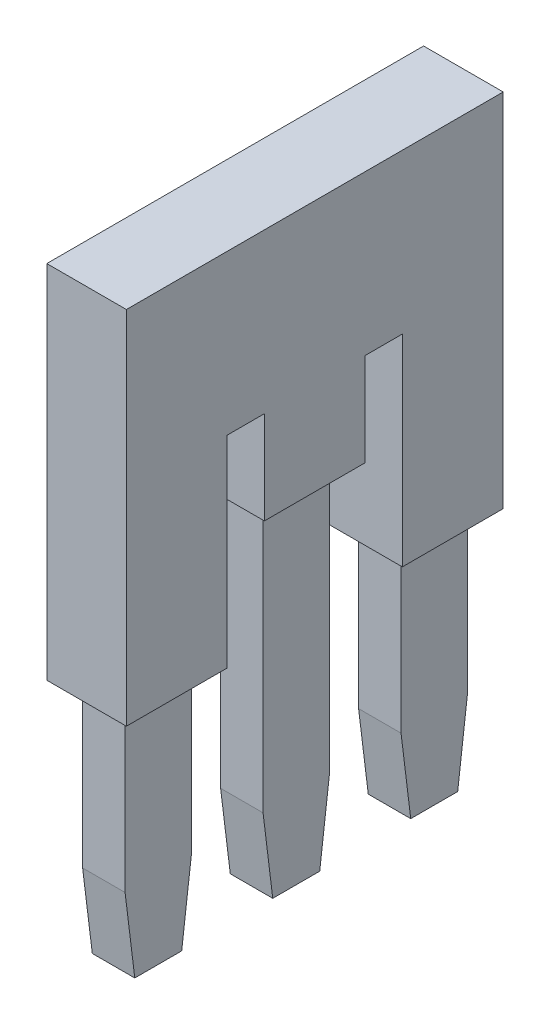
ISO-10303-21;
HEADER;
FILE_DESCRIPTION(('STEP AP214'),'2;1');
FILE_NAME('part.step','',(''),(''),'','','');
FILE_SCHEMA(('AUTOMOTIVE_DESIGN { 1 0 10303 214 1 1 1 1 }'));
ENDSEC;
DATA;
#1=APPLICATION_CONTEXT('core data for automotive mechanical design processes');
#2=APPLICATION_PROTOCOL_DEFINITION('international standard','automotive_design',2000,#1);
#3=PRODUCT_CONTEXT('',#1,'mechanical');
#4=PRODUCT('Part','Part','',(#3));
#5=PRODUCT_RELATED_PRODUCT_CATEGORY('part','',(#4));
#6=PRODUCT_DEFINITION_FORMATION('','',#4);
#7=PRODUCT_DEFINITION_CONTEXT('part definition',#1,'design');
#8=PRODUCT_DEFINITION('design','',#6,#7);
#9=PRODUCT_DEFINITION_SHAPE('','',#8);
#10=(LENGTH_UNIT() NAMED_UNIT(*) SI_UNIT(.MILLI.,.METRE.));
#11=(NAMED_UNIT(*) PLANE_ANGLE_UNIT() SI_UNIT($,.RADIAN.));
#12=(NAMED_UNIT(*) SI_UNIT($,.STERADIAN.) SOLID_ANGLE_UNIT());
#13=UNCERTAINTY_MEASURE_WITH_UNIT(LENGTH_MEASURE(1.E-05),#10,'distance_accuracy_value','');
#14=(GEOMETRIC_REPRESENTATION_CONTEXT(3) GLOBAL_UNCERTAINTY_ASSIGNED_CONTEXT((#13)) GLOBAL_UNIT_ASSIGNED_CONTEXT((#10,
#11,#12)) REPRESENTATION_CONTEXT('',''));
#15=CARTESIAN_POINT('',(0.,0.,0.));
#16=DIRECTION('',(0.,0.,1.));
#17=DIRECTION('',(1.,0.,0.));
#18=AXIS2_PLACEMENT_3D('',#15,#16,#17);
#19=CARTESIAN_POINT('',(3.17716482169511,-32.7169636307876,55.2099999999973));
#20=DIRECTION('',(0.,0.,1.));
#21=DIRECTION('',(1.,0.,0.));
#22=AXIS2_PLACEMENT_3D('',#19,#20,#21);
#23=PLANE('',#22);
#24=DIRECTION('',(1.,0.,0.));
#25=VECTOR('',#24,1.);
#26=CARTESIAN_POINT('',(4.10716722169511,-28.8757738570799,55.2099999999978));
#27=LINE('',#26,#25);
#28=CARTESIAN_POINT('',(3.30716722169511,-28.87577385708,55.2099999999974));
#29=VERTEX_POINT('',#28);
#30=CARTESIAN_POINT('',(4.90716722169511,-28.8757738570791,55.2099999999974));
#31=VERTEX_POINT('',#30);
#32=EDGE_CURVE('E232',#29,#31,#27,.T.);
#33=ORIENTED_EDGE('',*,*,#32,.F.);
#34=DIRECTION('',(0.,1.,0.));
#35=VECTOR('',#34,1.);
#36=CARTESIAN_POINT('',(3.30716722169511,-28.3020042035837,55.2099999999973));
#37=LINE('',#36,#35);
#38=CARTESIAN_POINT('',(3.30716722169511,-22.7750000000004,55.2099999999973));
#39=VERTEX_POINT('',#38);
#40=EDGE_CURVE('E217',#29,#39,#37,.T.);
#41=ORIENTED_EDGE('',*,*,#40,.T.);
#42=DIRECTION('',(1.,0.,0.));
#43=VECTOR('',#42,1.);
#44=CARTESIAN_POINT('',(3.17716482169511,-22.7750000000004,55.2099999999973));
#45=LINE('',#44,#43);
#46=CARTESIAN_POINT('',(4.90716722169511,-22.7750000000004,55.2099999999973));
#47=VERTEX_POINT('',#46);
#48=EDGE_CURVE('E19',#47,#39,#45,.F.);
#49=ORIENTED_EDGE('',*,*,#48,.F.);
#50=DIRECTION('',(0.,1.,0.));
#51=VECTOR('',#50,1.);
#52=CARTESIAN_POINT('',(4.90716722169511,-28.3020042035837,55.2099999999973));
#53=LINE('',#52,#51);
#54=EDGE_CURVE('E234',#31,#47,#53,.T.);
#55=ORIENTED_EDGE('',*,*,#54,.F.);
#56=EDGE_LOOP('',(#33,#41,#49,#55));
#57=FACE_BOUND('',#56,.T.);
#58=ADVANCED_FACE('F16',(#57),#23,.F.);
#59=CARTESIAN_POINT('',(4.10716722169511,-28.8757738570788,57.7100000000011));
#60=DIRECTION('',(0.,0.,1.));
#61=DIRECTION('',(0.,-1.,0.));
#62=AXIS2_PLACEMENT_3D('',#59,#60,#61);
#63=PLANE('',#62);
#64=DIRECTION('',(0.,1.,0.));
#65=VECTOR('',#64,1.);
#66=CARTESIAN_POINT('',(3.30716722169511,-28.3020042035837,57.7100000000012));
#67=LINE('',#66,#65);
#68=CARTESIAN_POINT('',(3.30716722169511,-22.7750000000004,57.7100000000012));
#69=VERTEX_POINT('',#68);
#70=CARTESIAN_POINT('',(3.30716722169511,-28.8757738570791,57.7100000000011));
#71=VERTEX_POINT('',#70);
#72=EDGE_CURVE('E228',#69,#71,#67,.F.);
#73=ORIENTED_EDGE('',*,*,#72,.T.);
#74=DIRECTION('',(1.,0.,0.));
#75=VECTOR('',#74,1.);
#76=CARTESIAN_POINT('',(4.10716722169511,-28.8757738570798,57.7100000000011));
#77=LINE('',#76,#75);
#78=CARTESIAN_POINT('',(4.90716722169511,-28.8757738570791,57.7100000000011));
#79=VERTEX_POINT('',#78);
#80=EDGE_CURVE('E210',#79,#71,#77,.F.);
#81=ORIENTED_EDGE('',*,*,#80,.F.);
#82=DIRECTION('',(0.,1.,0.));
#83=VECTOR('',#82,1.);
#84=CARTESIAN_POINT('',(4.90716722169511,-28.3020042035837,57.7100000000012));
#85=LINE('',#84,#83);
#86=CARTESIAN_POINT('',(4.90716722169511,-22.7750000000004,57.7100000000012));
#87=VERTEX_POINT('',#86);
#88=EDGE_CURVE('E245',#87,#79,#85,.F.);
#89=ORIENTED_EDGE('',*,*,#88,.F.);
#90=DIRECTION('',(1.,0.,0.));
#91=VECTOR('',#90,1.);
#92=CARTESIAN_POINT('',(4.10716722169511,-22.7750000000004,57.7100000000012));
#93=LINE('',#92,#91);
#94=EDGE_CURVE('E279',#87,#69,#93,.F.);
#95=ORIENTED_EDGE('',*,*,#94,.T.);
#96=EDGE_LOOP('',(#73,#81,#89,#95));
#97=FACE_BOUND('',#96,.T.);
#98=ADVANCED_FACE('F303',(#97),#63,.T.);
#99=CARTESIAN_POINT('',(4.10716722169511,-31.410934671701,57.3987213925599));
#100=DIRECTION('',(0.,-0.121869343405031,0.992546151641336));
#101=DIRECTION('',(0.,-0.992546151641336,-0.121869343405031));
#102=AXIS2_PLACEMENT_3D('',#99,#100,#101);
#103=PLANE('',#102);
#104=DIRECTION('',(0.,-0.992546151641336,-0.121869343405031));
#105=VECTOR('',#104,1.);
#106=CARTESIAN_POINT('',(3.30716722169511,-28.8757738570788,57.7100000000012));
#107=LINE('',#106,#105);
#108=CARTESIAN_POINT('',(3.30716722169511,-31.8499999999905,57.3448109490182));
#109=VERTEX_POINT('',#108);
#110=EDGE_CURVE('E247',#71,#109,#107,.T.);
#111=ORIENTED_EDGE('',*,*,#110,.T.);
#112=DIRECTION('',(1.,0.,0.));
#113=VECTOR('',#112,1.);
#114=CARTESIAN_POINT('',(4.10716722169511,-31.8499999999905,57.3448109490182));
#115=LINE('',#114,#113);
#116=CARTESIAN_POINT('',(4.90716722169511,-31.8499999999905,57.3448109490182));
#117=VERTEX_POINT('',#116);
#118=EDGE_CURVE('E239',#117,#109,#115,.F.);
#119=ORIENTED_EDGE('',*,*,#118,.F.);
#120=DIRECTION('',(0.,-0.992546151641336,-0.121869343405037));
#121=VECTOR('',#120,1.);
#122=CARTESIAN_POINT('',(4.90716722169511,-28.8757738570798,57.7100000000011));
#123=LINE('',#122,#121);
#124=EDGE_CURVE('E298',#79,#117,#123,.T.);
#125=ORIENTED_EDGE('',*,*,#124,.F.);
#126=ORIENTED_EDGE('',*,*,#80,.T.);
#127=EDGE_LOOP('',(#111,#119,#125,#126));
#128=FACE_BOUND('',#127,.T.);
#129=ADVANCED_FACE('F304',(#128),#103,.T.);
#130=CARTESIAN_POINT('',(4.10716722169511,-31.8500000000028,56.6599999999952));
#131=DIRECTION('',(0.,-1.,1.79170101017188E-11));
#132=DIRECTION('',(0.,-1.79170101017188E-11,-1.));
#133=AXIS2_PLACEMENT_3D('',#130,#131,#132);
#134=PLANE('',#133);
#135=DIRECTION('',(0.,0.,-1.));
#136=VECTOR('',#135,1.);
#137=CARTESIAN_POINT('',(3.30716722169511,-31.8499999999905,55.4470426133459));
#138=LINE('',#137,#136);
#139=CARTESIAN_POINT('',(3.30716722169511,-31.8500000000143,55.5751890509835));
#140=VERTEX_POINT('',#139);
#141=EDGE_CURVE('E243',#109,#140,#138,.T.);
#142=ORIENTED_EDGE('',*,*,#141,.T.);
#143=DIRECTION('',(1.,0.,0.));
#144=VECTOR('',#143,1.);
#145=CARTESIAN_POINT('',(4.10716722169511,-31.8500000000222,55.5751890509845));
#146=LINE('',#145,#144);
#147=CARTESIAN_POINT('',(4.90716722169511,-31.8500000000143,55.5751890509835));
#148=VERTEX_POINT('',#147);
#149=EDGE_CURVE('E238',#148,#140,#146,.F.);
#150=ORIENTED_EDGE('',*,*,#149,.F.);
#151=DIRECTION('',(0.,0.,-1.));
#152=VECTOR('',#151,1.);
#153=CARTESIAN_POINT('',(4.90716722169511,-31.8499999999905,55.4470426133458));
#154=LINE('',#153,#152);
#155=EDGE_CURVE('E292',#117,#148,#154,.T.);
#156=ORIENTED_EDGE('',*,*,#155,.F.);
#157=ORIENTED_EDGE('',*,*,#118,.T.);
#158=EDGE_LOOP('',(#142,#150,#156,#157));
#159=FACE_BOUND('',#158,.T.);
#160=ADVANCED_FACE('F306',(#159),#134,.T.);
#161=CARTESIAN_POINT('',(4.10716722169511,-28.5499999999608,55.1699999999978));
#162=DIRECTION('',(0.,-0.121869343405031,-0.992546151641336));
#163=DIRECTION('',(0.,0.992546151641336,-0.121869343405031));
#164=AXIS2_PLACEMENT_3D('',#161,#162,#163);
#165=PLANE('',#164);
#166=ORIENTED_EDGE('',*,*,#149,.T.);
#167=DIRECTION('',(0.,0.992546151641318,-0.12186934340518));
#168=VECTOR('',#167,1.);
#169=CARTESIAN_POINT('',(3.30716722169511,-31.8500000000222,55.5751890509845));
#170=LINE('',#169,#168);
#171=EDGE_CURVE('E222',#140,#29,#170,.T.);
#172=ORIENTED_EDGE('',*,*,#171,.T.);
#173=ORIENTED_EDGE('',*,*,#32,.T.);
#174=DIRECTION('',(0.,0.992546151641336,-0.121869343405034));
#175=VECTOR('',#174,1.);
#176=CARTESIAN_POINT('',(4.90716722169511,-31.8500000000222,55.5751890509845));
#177=LINE('',#176,#175);
#178=EDGE_CURVE('E290',#148,#31,#177,.T.);
#179=ORIENTED_EDGE('',*,*,#178,.F.);
#180=EDGE_LOOP('',(#166,#172,#173,#179));
#181=FACE_BOUND('',#180,.T.);
#182=ADVANCED_FACE('F241',(#181),#165,.T.);
#183=CARTESIAN_POINT('',(3.30716722169511,-31.8500000000099,45.8600000000035));
#184=DIRECTION('',(0.,-1.,1.79170101017188E-11));
#185=DIRECTION('',(0.,-1.79170101017188E-11,-1.));
#186=AXIS2_PLACEMENT_3D('',#183,#184,#185);
#187=PLANE('',#186);
#188=DIRECTION('',(0.,0.,-1.));
#189=VECTOR('',#188,1.);
#190=CARTESIAN_POINT('',(3.30716722169511,-31.8499999999905,34.6470426133458));
#191=LINE('',#190,#189);
#192=CARTESIAN_POINT('',(3.30716722169511,-31.8499999999905,46.9448109490182));
#193=VERTEX_POINT('',#192);
#194=CARTESIAN_POINT('',(3.30716722169511,-31.8500000000143,45.1751890509835));
#195=VERTEX_POINT('',#194);
#196=EDGE_CURVE('E437',#193,#195,#191,.T.);
#197=ORIENTED_EDGE('',*,*,#196,.T.);
#198=DIRECTION('',(1.,0.,0.));
#199=VECTOR('',#198,1.);
#200=CARTESIAN_POINT('',(4.10716722169511,-31.8500000000222,45.1751890509845));
#201=LINE('',#200,#199);
#202=CARTESIAN_POINT('',(4.90716722169511,-31.8500000000143,45.1751890509835));
#203=VERTEX_POINT('',#202);
#204=EDGE_CURVE('E275',#203,#195,#201,.F.);
#205=ORIENTED_EDGE('',*,*,#204,.F.);
#206=DIRECTION('',(0.,0.,-1.));
#207=VECTOR('',#206,1.);
#208=CARTESIAN_POINT('',(4.90716722169511,-31.8499999999905,34.6470426133458));
#209=LINE('',#208,#207);
#210=CARTESIAN_POINT('',(4.90716722169511,-31.8499999999905,46.9448109490182));
#211=VERTEX_POINT('',#210);
#212=EDGE_CURVE('E447',#211,#203,#209,.T.);
#213=ORIENTED_EDGE('',*,*,#212,.F.);
#214=DIRECTION('',(1.,0.,0.));
#215=VECTOR('',#214,1.);
#216=CARTESIAN_POINT('',(3.30716722169511,-31.8499999999905,46.9448109490181));
#217=LINE('',#216,#215);
#218=EDGE_CURVE('E265',#193,#211,#217,.T.);
#219=ORIENTED_EDGE('',*,*,#218,.F.);
#220=EDGE_LOOP('',(#197,#205,#213,#219));
#221=FACE_BOUND('',#220,.T.);
#222=ADVANCED_FACE('F314',(#221),#187,.T.);
#223=CARTESIAN_POINT('',(4.10716722169511,-31.410934671701,45.1212786074389));
#224=DIRECTION('',(0.,-0.121869343405031,-0.992546151641336));
#225=DIRECTION('',(0.,0.992546151641336,-0.121869343405031));
#226=AXIS2_PLACEMENT_3D('',#223,#224,#225);
#227=PLANE('',#226);
#228=DIRECTION('',(0.,0.992546151641333,-0.121869343405054));
#229=VECTOR('',#228,1.);
#230=CARTESIAN_POINT('',(4.90716722169511,-31.8500000000222,45.1751890509845));
#231=LINE('',#230,#229);
#232=CARTESIAN_POINT('',(4.90716722169511,-28.87577385708,44.8099999999976));
#233=VERTEX_POINT('',#232);
#234=EDGE_CURVE('E539',#203,#233,#231,.T.);
#235=ORIENTED_EDGE('',*,*,#234,.F.);
#236=ORIENTED_EDGE('',*,*,#204,.T.);
#237=DIRECTION('',(0.,0.992546151641335,-0.121869343405046));
#238=VECTOR('',#237,1.);
#239=CARTESIAN_POINT('',(3.30716722169511,-31.8500000000222,45.1751890509845));
#240=LINE('',#239,#238);
#241=CARTESIAN_POINT('',(3.30716722169511,-28.87577385708,44.8099999999975));
#242=VERTEX_POINT('',#241);
#243=EDGE_CURVE('E443',#195,#242,#240,.T.);
#244=ORIENTED_EDGE('',*,*,#243,.T.);
#245=DIRECTION('',(-1.,0.,0.));
#246=VECTOR('',#245,1.);
#247=CARTESIAN_POINT('',(4.10716722169511,-28.8757738570801,44.8099999999973));
#248=LINE('',#247,#246);
#249=EDGE_CURVE('E273',#233,#242,#248,.T.);
#250=ORIENTED_EDGE('',*,*,#249,.F.);
#251=EDGE_LOOP('',(#235,#236,#244,#250));
#252=FACE_BOUND('',#251,.T.);
#253=ADVANCED_FACE('F425',(#252),#227,.T.);
#254=CARTESIAN_POINT('',(4.10716722169511,-28.87577385708,44.8099999999973));
#255=DIRECTION('',(0.,0.,-1.));
#256=DIRECTION('',(-1.,0.,0.));
#257=AXIS2_PLACEMENT_3D('',#254,#255,#256);
#258=PLANE('',#257);
#259=DIRECTION('',(-1.,0.,0.));
#260=VECTOR('',#259,1.);
#261=CARTESIAN_POINT('',(4.10716722169511,-22.7750000000004,44.8099999999973));
#262=LINE('',#261,#260);
#263=CARTESIAN_POINT('',(3.30716722169511,-22.7750000000004,44.8099999999977));
#264=VERTEX_POINT('',#263);
#265=CARTESIAN_POINT('',(4.90716722169511,-22.7750000000004,44.8099999999977));
#266=VERTEX_POINT('',#265);
#267=EDGE_CURVE('E271',#264,#266,#262,.F.);
#268=ORIENTED_EDGE('',*,*,#267,.T.);
#269=DIRECTION('',(0.,1.,0.));
#270=VECTOR('',#269,1.);
#271=CARTESIAN_POINT('',(4.90716722169511,-28.3020042035837,44.8099999999977));
#272=LINE('',#271,#270);
#273=EDGE_CURVE('E536',#233,#266,#272,.T.);
#274=ORIENTED_EDGE('',*,*,#273,.F.);
#275=ORIENTED_EDGE('',*,*,#249,.T.);
#276=DIRECTION('',(0.,1.,0.));
#277=VECTOR('',#276,1.);
#278=CARTESIAN_POINT('',(3.30716722169511,-28.3020042035837,44.8099999999977));
#279=LINE('',#278,#277);
#280=EDGE_CURVE('E293',#242,#264,#279,.T.);
#281=ORIENTED_EDGE('',*,*,#280,.T.);
#282=EDGE_LOOP('',(#268,#274,#275,#281));
#283=FACE_BOUND('',#282,.T.);
#284=ADVANCED_FACE('F421',(#283),#258,.T.);
#285=CARTESIAN_POINT('',(4.23716962169511,-32.7169636307876,47.3100000000012));
#286=DIRECTION('',(0.,0.,-1.));
#287=DIRECTION('',(-1.,0.,0.));
#288=AXIS2_PLACEMENT_3D('',#285,#286,#287);
#289=PLANE('',#288);
#290=DIRECTION('',(1.,0.,0.));
#291=VECTOR('',#290,1.);
#292=CARTESIAN_POINT('',(3.30716722169511,-28.8757738570788,47.3100000000011));
#293=LINE('',#292,#291);
#294=CARTESIAN_POINT('',(4.90716722169511,-28.8757738570792,47.3100000000011));
#295=VERTEX_POINT('',#294);
#296=CARTESIAN_POINT('',(3.30716722169511,-28.8757738570788,47.3100000000012));
#297=VERTEX_POINT('',#296);
#298=EDGE_CURVE('E267',#295,#297,#293,.F.);
#299=ORIENTED_EDGE('',*,*,#298,.F.);
#300=DIRECTION('',(0.,1.,0.));
#301=VECTOR('',#300,1.);
#302=CARTESIAN_POINT('',(4.90716722169511,-28.3020042035837,47.310000000001));
#303=LINE('',#302,#301);
#304=CARTESIAN_POINT('',(4.90716722169511,-22.7750000000004,47.3100000000012));
#305=VERTEX_POINT('',#304);
#306=EDGE_CURVE('E534',#305,#295,#303,.F.);
#307=ORIENTED_EDGE('',*,*,#306,.F.);
#308=DIRECTION('',(-1.,0.,0.));
#309=VECTOR('',#308,1.);
#310=CARTESIAN_POINT('',(4.23716962169511,-22.7750000000004,47.3100000000012));
#311=LINE('',#310,#309);
#312=CARTESIAN_POINT('',(3.30716722169511,-22.7750000000004,47.3100000000012));
#313=VERTEX_POINT('',#312);
#314=EDGE_CURVE('E269',#313,#305,#311,.F.);
#315=ORIENTED_EDGE('',*,*,#314,.F.);
#316=DIRECTION('',(0.,1.,0.));
#317=VECTOR('',#316,1.);
#318=CARTESIAN_POINT('',(3.30716722169511,-28.3020042035837,47.3100000000012));
#319=LINE('',#318,#317);
#320=EDGE_CURVE('E296',#313,#297,#319,.F.);
#321=ORIENTED_EDGE('',*,*,#320,.T.);
#322=EDGE_LOOP('',(#299,#307,#315,#321));
#323=FACE_BOUND('',#322,.T.);
#324=ADVANCED_FACE('F417',(#323),#289,.F.);
#325=CARTESIAN_POINT('',(3.30716722169511,-31.410934671701,46.9987213925598));
#326=DIRECTION('',(0.,-0.121869343405031,0.992546151641336));
#327=DIRECTION('',(0.,-0.992546151641336,-0.121869343405031));
#328=AXIS2_PLACEMENT_3D('',#325,#326,#327);
#329=PLANE('',#328);
#330=ORIENTED_EDGE('',*,*,#218,.T.);
#331=DIRECTION('',(0.,-0.992546151641336,-0.121869343405033));
#332=VECTOR('',#331,1.);
#333=CARTESIAN_POINT('',(4.90716722169511,-28.8757738570788,47.3100000000012));
#334=LINE('',#333,#332);
#335=EDGE_CURVE('E531',#295,#211,#334,.T.);
#336=ORIENTED_EDGE('',*,*,#335,.F.);
#337=ORIENTED_EDGE('',*,*,#298,.T.);
#338=DIRECTION('',(0.,-0.992546151641336,-0.121869343405033));
#339=VECTOR('',#338,1.);
#340=CARTESIAN_POINT('',(3.30716722169511,-28.8757738570788,47.3100000000012));
#341=LINE('',#340,#339);
#342=EDGE_CURVE('E444',#297,#193,#341,.T.);
#343=ORIENTED_EDGE('',*,*,#342,.T.);
#344=EDGE_LOOP('',(#330,#336,#337,#343));
#345=FACE_BOUND('',#344,.T.);
#346=ADVANCED_FACE('F413',(#345),#329,.T.);
#347=CARTESIAN_POINT('',(4.10716722169511,-31.410934671701,50.3212786074393));
#348=DIRECTION('',(0.,-0.121869343405041,-0.992546151641335));
#349=DIRECTION('',(0.,0.992546151641335,-0.121869343405041));
#350=AXIS2_PLACEMENT_3D('',#347,#348,#349);
#351=PLANE('',#350);
#352=DIRECTION('',(0.,-0.992546151641337,0.121869343405021));
#353=VECTOR('',#352,1.);
#354=CARTESIAN_POINT('',(4.90716722169511,-28.87577385708,50.0099999999981));
#355=LINE('',#354,#353);
#356=CARTESIAN_POINT('',(4.90716722169511,-28.87577385708,50.0099999999981));
#357=VERTEX_POINT('',#356);
#358=CARTESIAN_POINT('',(4.90716722169511,-31.8500000000294,50.3751890509857));
#359=VERTEX_POINT('',#358);
#360=EDGE_CURVE('E517',#357,#359,#355,.T.);
#361=ORIENTED_EDGE('',*,*,#360,.T.);
#362=DIRECTION('',(1.,0.,0.));
#363=VECTOR('',#362,1.);
#364=CARTESIAN_POINT('',(4.10716722169511,-31.8500000000293,50.3751890509857));
#365=LINE('',#364,#363);
#366=CARTESIAN_POINT('',(3.30716722168535,-31.8500000000294,50.3751890509857));
#367=VERTEX_POINT('',#366);
#368=EDGE_CURVE('E263',#367,#359,#365,.T.);
#369=ORIENTED_EDGE('',*,*,#368,.F.);
#370=DIRECTION('',(0.,-0.992546151641337,0.121869343405021));
#371=VECTOR('',#370,1.);
#372=CARTESIAN_POINT('',(3.30716722168535,-28.87577385708,50.0099999999981));
#373=LINE('',#372,#371);
#374=CARTESIAN_POINT('',(3.30716722168535,-28.87577385708,50.0099999999981));
#375=VERTEX_POINT('',#374);
#376=EDGE_CURVE('E512',#375,#367,#373,.T.);
#377=ORIENTED_EDGE('',*,*,#376,.F.);
#378=DIRECTION('',(-1.,0.,0.));
#379=VECTOR('',#378,1.);
#380=CARTESIAN_POINT('',(4.10716722169511,-28.87577385708,50.0099999999981));
#381=LINE('',#380,#379);
#382=EDGE_CURVE('E255',#357,#375,#381,.T.);
#383=ORIENTED_EDGE('',*,*,#382,.F.);
#384=EDGE_LOOP('',(#361,#369,#377,#383));
#385=FACE_BOUND('',#384,.T.);
#386=ADVANCED_FACE('F409',(#385),#351,.T.);
#387=CARTESIAN_POINT('',(4.10716722169511,-31.8500000000099,51.4599999999956));
#388=DIRECTION('',(0.,-1.,1.79170101017133E-11));
#389=DIRECTION('',(0.,-1.79170101017133E-11,-1.));
#390=AXIS2_PLACEMENT_3D('',#387,#388,#389);
#391=PLANE('',#390);
#392=DIRECTION('',(0.,0.,1.));
#393=VECTOR('',#392,1.);
#394=CARTESIAN_POINT('',(3.30716722168535,-31.8500000000294,51.379551985078));
#395=LINE('',#394,#393);
#396=CARTESIAN_POINT('',(3.30716722168535,-31.8500000000056,52.1448109490169));
#397=VERTEX_POINT('',#396);
#398=EDGE_CURVE('E510',#367,#397,#395,.T.);
#399=ORIENTED_EDGE('',*,*,#398,.F.);
#400=ORIENTED_EDGE('',*,*,#368,.T.);
#401=DIRECTION('',(0.,0.,1.));
#402=VECTOR('',#401,1.);
#403=CARTESIAN_POINT('',(4.90716722169511,-31.8500000000294,51.379551985078));
#404=LINE('',#403,#402);
#405=CARTESIAN_POINT('',(4.90716722169511,-31.8500000000056,52.144810949017));
#406=VERTEX_POINT('',#405);
#407=EDGE_CURVE('E514',#359,#406,#404,.T.);
#408=ORIENTED_EDGE('',*,*,#407,.T.);
#409=DIRECTION('',(1.,0.,0.));
#410=VECTOR('',#409,1.);
#411=CARTESIAN_POINT('',(4.10716722169511,-31.8499999999977,52.1448109490179));
#412=LINE('',#411,#410);
#413=EDGE_CURVE('E261',#397,#406,#412,.T.);
#414=ORIENTED_EDGE('',*,*,#413,.F.);
#415=EDGE_LOOP('',(#399,#400,#408,#414));
#416=FACE_BOUND('',#415,.T.);
#417=ADVANCED_FACE('F405',(#416),#391,.T.);
#418=CARTESIAN_POINT('',(4.10716722169511,-31.410934671701,52.1987213925605));
#419=DIRECTION('',(0.,-0.121869343405041,0.992546151641335));
#420=DIRECTION('',(0.,-0.992546151641335,-0.121869343405041));
#421=AXIS2_PLACEMENT_3D('',#418,#419,#420);
#422=PLANE('',#421);
#423=DIRECTION('',(1.,0.,0.));
#424=VECTOR('',#423,1.);
#425=CARTESIAN_POINT('',(4.10716722169511,-28.8757738570883,52.5100000000007));
#426=LINE('',#425,#424);
#427=CARTESIAN_POINT('',(3.30716722168535,-28.8757738570883,52.5100000000007));
#428=VERTEX_POINT('',#427);
#429=CARTESIAN_POINT('',(4.90716722169511,-28.8757738570883,52.5100000000007));
#430=VERTEX_POINT('',#429);
#431=EDGE_CURVE('E259',#428,#430,#426,.T.);
#432=ORIENTED_EDGE('',*,*,#431,.F.);
#433=DIRECTION('',(0.,0.992546151641333,0.121869343405058));
#434=VECTOR('',#433,1.);
#435=CARTESIAN_POINT('',(3.30716722168535,-31.8499999999977,52.1448109490179));
#436=LINE('',#435,#434);
#437=EDGE_CURVE('E508',#397,#428,#436,.T.);
#438=ORIENTED_EDGE('',*,*,#437,.F.);
#439=ORIENTED_EDGE('',*,*,#413,.T.);
#440=DIRECTION('',(0.,0.992546151641333,0.121869343405058));
#441=VECTOR('',#440,1.);
#442=CARTESIAN_POINT('',(4.90716722169511,-31.8499999999977,52.1448109490179));
#443=LINE('',#442,#441);
#444=EDGE_CURVE('E526',#406,#430,#443,.T.);
#445=ORIENTED_EDGE('',*,*,#444,.T.);
#446=EDGE_LOOP('',(#432,#438,#439,#445));
#447=FACE_BOUND('',#446,.T.);
#448=ADVANCED_FACE('F401',(#447),#422,.T.);
#449=CARTESIAN_POINT('',(4.10716722169511,-28.8757738570883,52.5100000000007));
#450=DIRECTION('',(0.,0.,1.));
#451=DIRECTION('',(1.,0.,0.));
#452=AXIS2_PLACEMENT_3D('',#449,#450,#451);
#453=PLANE('',#452);
#454=DIRECTION('',(1.,0.,0.));
#455=VECTOR('',#454,1.);
#456=CARTESIAN_POINT('',(4.10716722169511,-18.6750000000004,52.5100000000007));
#457=LINE('',#456,#455);
#458=CARTESIAN_POINT('',(4.90716722169511,-18.6750000000004,52.5100000000007));
#459=VERTEX_POINT('',#458);
#460=CARTESIAN_POINT('',(3.30716722168535,-18.6750000000004,52.5100000000007));
#461=VERTEX_POINT('',#460);
#462=EDGE_CURVE('E257',#459,#461,#457,.F.);
#463=ORIENTED_EDGE('',*,*,#462,.T.);
#464=DIRECTION('',(0.,1.,0.));
#465=VECTOR('',#464,1.);
#466=CARTESIAN_POINT('',(3.30716722168535,-27.6497789998261,52.5100000000007));
#467=LINE('',#466,#465);
#468=EDGE_CURVE('E505',#428,#461,#467,.T.);
#469=ORIENTED_EDGE('',*,*,#468,.F.);
#470=ORIENTED_EDGE('',*,*,#431,.T.);
#471=DIRECTION('',(0.,1.,0.));
#472=VECTOR('',#471,1.);
#473=CARTESIAN_POINT('',(4.90716722169511,-27.6247789998288,52.5100000000007));
#474=LINE('',#473,#472);
#475=EDGE_CURVE('E523',#430,#459,#474,.T.);
#476=ORIENTED_EDGE('',*,*,#475,.T.);
#477=EDGE_LOOP('',(#463,#469,#470,#476));
#478=FACE_BOUND('',#477,.T.);
#479=ADVANCED_FACE('F397',(#478),#453,.T.);
#480=CARTESIAN_POINT('',(4.10716722169511,-28.87577385708,50.0099999999981));
#481=DIRECTION('',(0.,0.,-1.));
#482=DIRECTION('',(-1.,0.,0.));
#483=AXIS2_PLACEMENT_3D('',#480,#481,#482);
#484=PLANE('',#483);
#485=DIRECTION('',(-1.,0.,0.));
#486=VECTOR('',#485,1.);
#487=CARTESIAN_POINT('',(4.10716722169511,-18.6750000000004,50.0099999999981));
#488=LINE('',#487,#486);
#489=CARTESIAN_POINT('',(3.30716722168535,-18.6750000000004,50.0099999999981));
#490=VERTEX_POINT('',#489);
#491=CARTESIAN_POINT('',(4.90716722169511,-18.6750000000004,50.0099999999981));
#492=VERTEX_POINT('',#491);
#493=EDGE_CURVE('E229',#490,#492,#488,.F.);
#494=ORIENTED_EDGE('',*,*,#493,.T.);
#495=DIRECTION('',(0.,1.,0.));
#496=VECTOR('',#495,1.);
#497=CARTESIAN_POINT('',(4.90716722169511,-27.6247789998288,50.0099999999981));
#498=LINE('',#497,#496);
#499=EDGE_CURVE('E520',#492,#357,#498,.F.);
#500=ORIENTED_EDGE('',*,*,#499,.T.);
#501=ORIENTED_EDGE('',*,*,#382,.T.);
#502=DIRECTION('',(0.,1.,0.));
#503=VECTOR('',#502,1.);
#504=CARTESIAN_POINT('',(3.30716722168535,-27.6497789998261,50.0099999999981));
#505=LINE('',#504,#503);
#506=EDGE_CURVE('E502',#490,#375,#505,.F.);
#507=ORIENTED_EDGE('',*,*,#506,.F.);
#508=EDGE_LOOP('',(#494,#500,#501,#507));
#509=FACE_BOUND('',#508,.T.);
#510=ADVANCED_FACE('F394',(#509),#484,.T.);
#511=CARTESIAN_POINT('',(3.30716722169511,-28.3020042035837,55.4470426133459));
#512=DIRECTION('',(1.,0.,0.));
#513=DIRECTION('',(0.,0.,-1.));
#514=AXIS2_PLACEMENT_3D('',#511,#512,#513);
#515=PLANE('',#514);
#516=ORIENTED_EDGE('',*,*,#141,.F.);
#517=ORIENTED_EDGE('',*,*,#110,.F.);
#518=ORIENTED_EDGE('',*,*,#72,.F.);
#519=DIRECTION('',(0.,0.,-1.));
#520=VECTOR('',#519,1.);
#521=CARTESIAN_POINT('',(3.30716722169511,-22.7750000000004,58.3599999999988));
#522=LINE('',#521,#520);
#523=EDGE_CURVE('E226',#39,#69,#522,.F.);
#524=ORIENTED_EDGE('',*,*,#523,.F.);
#525=ORIENTED_EDGE('',*,*,#40,.F.);
#526=ORIENTED_EDGE('',*,*,#171,.F.);
#527=EDGE_LOOP('',(#516,#517,#518,#524,#525,#526));
#528=FACE_BOUND('',#527,.T.);
#529=ADVANCED_FACE('F220',(#528),#515,.F.);
#530=CARTESIAN_POINT('',(4.90716722169511,-28.3020042035837,55.4470426133458));
#531=DIRECTION('',(1.,0.,0.));
#532=DIRECTION('',(0.,0.,-1.));
#533=AXIS2_PLACEMENT_3D('',#530,#531,#532);
#534=PLANE('',#533);
#535=ORIENTED_EDGE('',*,*,#155,.T.);
#536=ORIENTED_EDGE('',*,*,#178,.T.);
#537=ORIENTED_EDGE('',*,*,#54,.T.);
#538=DIRECTION('',(0.,0.,-1.));
#539=VECTOR('',#538,1.);
#540=CARTESIAN_POINT('',(4.90716722169511,-22.7750000000004,58.3599999999988));
#541=LINE('',#540,#539);
#542=EDGE_CURVE('E287',#87,#47,#541,.T.);
#543=ORIENTED_EDGE('',*,*,#542,.F.);
#544=ORIENTED_EDGE('',*,*,#88,.T.);
#545=ORIENTED_EDGE('',*,*,#124,.T.);
#546=EDGE_LOOP('',(#535,#536,#537,#543,#544,#545));
#547=FACE_BOUND('',#546,.T.);
#548=ADVANCED_FACE('F289',(#547),#534,.T.);
#549=CARTESIAN_POINT('',(3.30716722169511,-28.3020042035837,34.6470426133458));
#550=DIRECTION('',(1.,0.,0.));
#551=DIRECTION('',(0.,0.,-1.));
#552=AXIS2_PLACEMENT_3D('',#549,#550,#551);
#553=PLANE('',#552);
#554=ORIENTED_EDGE('',*,*,#196,.F.);
#555=ORIENTED_EDGE('',*,*,#342,.F.);
#556=ORIENTED_EDGE('',*,*,#320,.F.);
#557=DIRECTION('',(0.,0.,-1.));
#558=VECTOR('',#557,1.);
#559=CARTESIAN_POINT('',(3.30716722169511,-22.7750000000004,47.9599999999988));
#560=LINE('',#559,#558);
#561=EDGE_CURVE('E459',#264,#313,#560,.F.);
#562=ORIENTED_EDGE('',*,*,#561,.F.);
#563=ORIENTED_EDGE('',*,*,#280,.F.);
#564=ORIENTED_EDGE('',*,*,#243,.F.);
#565=EDGE_LOOP('',(#554,#555,#556,#562,#563,#564));
#566=FACE_BOUND('',#565,.T.);
#567=ADVANCED_FACE('F385',(#566),#553,.F.);
#568=CARTESIAN_POINT('',(4.90716722169511,-28.3020042035837,34.6470426133458));
#569=DIRECTION('',(1.,0.,0.));
#570=DIRECTION('',(0.,0.,-1.));
#571=AXIS2_PLACEMENT_3D('',#568,#569,#570);
#572=PLANE('',#571);
#573=ORIENTED_EDGE('',*,*,#306,.T.);
#574=ORIENTED_EDGE('',*,*,#335,.T.);
#575=ORIENTED_EDGE('',*,*,#212,.T.);
#576=ORIENTED_EDGE('',*,*,#234,.T.);
#577=ORIENTED_EDGE('',*,*,#273,.T.);
#578=DIRECTION('',(0.,0.,-1.));
#579=VECTOR('',#578,1.);
#580=CARTESIAN_POINT('',(4.90716722169511,-22.7750000000004,47.9599999999988));
#581=LINE('',#580,#579);
#582=EDGE_CURVE('E462',#305,#266,#581,.T.);
#583=ORIENTED_EDGE('',*,*,#582,.F.);
#584=EDGE_LOOP('',(#573,#574,#575,#576,#577,#583));
#585=FACE_BOUND('',#584,.T.);
#586=ADVANCED_FACE('F381',(#585),#572,.T.);
#587=CARTESIAN_POINT('',(5.00030634412967,-15.1750000000004,47.3339438048216));
#588=DIRECTION('',(0.,-1.,0.));
#589=DIRECTION('',(0.,0.,-1.));
#590=AXIS2_PLACEMENT_3D('',#587,#588,#589);
#591=PLANE('',#590);
#592=DIRECTION('',(1.,0.,0.));
#593=VECTOR('',#592,1.);
#594=CARTESIAN_POINT('',(5.60716722168537,-15.1750000000004,47.9599999999988));
#595=LINE('',#594,#593);
#596=CARTESIAN_POINT('',(5.60716722168537,-15.1750000000004,47.9599999999988));
#597=VERTEX_POINT('',#596);
#598=CARTESIAN_POINT('',(2.60716722168536,-15.1750000000004,47.9599999999988));
#599=VERTEX_POINT('',#598);
#600=EDGE_CURVE('E465',#597,#599,#595,.F.);
#601=ORIENTED_EDGE('',*,*,#600,.F.);
#602=DIRECTION('',(0.,0.,-1.));
#603=VECTOR('',#602,1.);
#604=CARTESIAN_POINT('',(5.60716722168537,-15.1750000000004,47.3339438048216));
#605=LINE('',#604,#603);
#606=CARTESIAN_POINT('',(5.60716722168537,-15.1750000000004,49.3599999999988));
#607=VERTEX_POINT('',#606);
#608=EDGE_CURVE('E529',#597,#607,#605,.F.);
#609=ORIENTED_EDGE('',*,*,#608,.T.);
#610=DIRECTION('',(-1.,0.,0.));
#611=VECTOR('',#610,1.);
#612=CARTESIAN_POINT('',(5.60716722168537,-15.1750000000004,49.3599999999988));
#613=LINE('',#612,#611);
#614=CARTESIAN_POINT('',(2.60716722168536,-15.1750000000004,49.3599999999988));
#615=VERTEX_POINT('',#614);
#616=EDGE_CURVE('E547',#615,#607,#613,.F.);
#617=ORIENTED_EDGE('',*,*,#616,.F.);
#618=DIRECTION('',(0.,0.,1.));
#619=VECTOR('',#618,1.);
#620=CARTESIAN_POINT('',(2.60716722168536,-15.1750000000004,52.8944836175016));
#621=LINE('',#620,#619);
#622=EDGE_CURVE('E498',#599,#615,#621,.T.);
#623=ORIENTED_EDGE('',*,*,#622,.F.);
#624=EDGE_LOOP('',(#601,#609,#617,#623));
#625=FACE_BOUND('',#624,.T.);
#626=ADVANCED_FACE('F377',(#625),#591,.T.);
#627=CARTESIAN_POINT('',(4.90716722169511,-27.6247789998288,51.379551985078));
#628=DIRECTION('',(-1.,0.,0.));
#629=DIRECTION('',(0.,0.,1.));
#630=AXIS2_PLACEMENT_3D('',#627,#628,#629);
#631=PLANE('',#630);
#632=ORIENTED_EDGE('',*,*,#360,.F.);
#633=ORIENTED_EDGE('',*,*,#499,.F.);
#634=DIRECTION('',(0.,0.,-1.));
#635=VECTOR('',#634,1.);
#636=CARTESIAN_POINT('',(4.90716722169511,-18.6750000000004,53.1599999999988));
#637=LINE('',#636,#635);
#638=EDGE_CURVE('E591',#459,#492,#637,.T.);
#639=ORIENTED_EDGE('',*,*,#638,.F.);
#640=ORIENTED_EDGE('',*,*,#475,.F.);
#641=ORIENTED_EDGE('',*,*,#444,.F.);
#642=ORIENTED_EDGE('',*,*,#407,.F.);
#643=EDGE_LOOP('',(#632,#633,#639,#640,#641,#642));
#644=FACE_BOUND('',#643,.T.);
#645=ADVANCED_FACE('F373',(#644),#631,.F.);
#646=CARTESIAN_POINT('',(3.30716722168535,-27.6497789998261,51.379551985078));
#647=DIRECTION('',(-1.,0.,0.));
#648=DIRECTION('',(0.,0.,1.));
#649=AXIS2_PLACEMENT_3D('',#646,#647,#648);
#650=PLANE('',#649);
#651=DIRECTION('',(0.,0.,-1.));
#652=VECTOR('',#651,1.);
#653=CARTESIAN_POINT('',(3.30716722168535,-18.6750000000004,53.1599999999988));
#654=LINE('',#653,#652);
#655=EDGE_CURVE('E588',#490,#461,#654,.F.);
#656=ORIENTED_EDGE('',*,*,#655,.F.);
#657=ORIENTED_EDGE('',*,*,#506,.T.);
#658=ORIENTED_EDGE('',*,*,#376,.T.);
#659=ORIENTED_EDGE('',*,*,#398,.T.);
#660=ORIENTED_EDGE('',*,*,#437,.T.);
#661=ORIENTED_EDGE('',*,*,#468,.T.);
#662=EDGE_LOOP('',(#656,#657,#658,#659,#660,#661));
#663=FACE_BOUND('',#662,.T.);
#664=ADVANCED_FACE('F369',(#663),#650,.T.);
#665=CARTESIAN_POINT('',(5.00030634412967,-15.1750000000004,47.3339438048216));
#666=DIRECTION('',(0.,-1.,0.));
#667=DIRECTION('',(0.,0.,-1.));
#668=AXIS2_PLACEMENT_3D('',#665,#666,#667);
#669=PLANE('',#668);
#670=DIRECTION('',(1.,0.,0.));
#671=VECTOR('',#670,1.);
#672=CARTESIAN_POINT('',(5.60716722168537,-15.1750000000004,53.1599999999988));
#673=LINE('',#672,#671);
#674=CARTESIAN_POINT('',(5.60716722168537,-15.1750000000004,53.1599999999988));
#675=VERTEX_POINT('',#674);
#676=CARTESIAN_POINT('',(2.60716722168536,-15.1750000000004,53.1599999999988));
#677=VERTEX_POINT('',#676);
#678=EDGE_CURVE('E586',#675,#677,#673,.F.);
#679=ORIENTED_EDGE('',*,*,#678,.F.);
#680=DIRECTION('',(0.,0.,-1.));
#681=VECTOR('',#680,1.);
#682=CARTESIAN_POINT('',(5.60716722168537,-15.1750000000004,47.3339438048216));
#683=LINE('',#682,#681);
#684=CARTESIAN_POINT('',(5.60716722168537,-15.1750000000004,54.5599999999988));
#685=VERTEX_POINT('',#684);
#686=EDGE_CURVE('E500',#675,#685,#683,.F.);
#687=ORIENTED_EDGE('',*,*,#686,.T.);
#688=DIRECTION('',(-1.,0.,0.));
#689=VECTOR('',#688,1.);
#690=CARTESIAN_POINT('',(5.60716722168537,-15.1750000000004,54.5599999999988));
#691=LINE('',#690,#689);
#692=CARTESIAN_POINT('',(2.60716722168536,-15.1750000000004,54.5599999999988));
#693=VERTEX_POINT('',#692);
#694=EDGE_CURVE('E490',#693,#685,#691,.F.);
#695=ORIENTED_EDGE('',*,*,#694,.F.);
#696=DIRECTION('',(0.,0.,1.));
#697=VECTOR('',#696,1.);
#698=CARTESIAN_POINT('',(2.60716722168536,-15.1750000000004,52.8944836175016));
#699=LINE('',#698,#697);
#700=EDGE_CURVE('E496',#677,#693,#699,.T.);
#701=ORIENTED_EDGE('',*,*,#700,.F.);
#702=EDGE_LOOP('',(#679,#687,#695,#701));
#703=FACE_BOUND('',#702,.T.);
#704=ADVANCED_FACE('F365',(#703),#669,.T.);
#705=CARTESIAN_POINT('',(2.60716722168536,-10.116373989214,52.8944836175016));
#706=DIRECTION('',(-1.,0.,0.));
#707=DIRECTION('',(0.,0.,1.));
#708=AXIS2_PLACEMENT_3D('',#705,#706,#707);
#709=PLANE('',#708);
#710=DIRECTION('',(0.,1.,0.));
#711=VECTOR('',#710,1.);
#712=CARTESIAN_POINT('',(2.60716722168536,-22.7750000000004,44.1599999999988));
#713=LINE('',#712,#711);
#714=CARTESIAN_POINT('',(2.60716722168536,-22.7750000000004,44.1599999999988));
#715=VERTEX_POINT('',#714);
#716=CARTESIAN_POINT('',(2.60716722168536,-9.1750000000004,44.1599999999988));
#717=VERTEX_POINT('',#716);
#718=EDGE_CURVE('E474',#715,#717,#713,.T.);
#719=ORIENTED_EDGE('',*,*,#718,.F.);
#720=DIRECTION('',(0.,0.,-1.));
#721=VECTOR('',#720,1.);
#722=CARTESIAN_POINT('',(2.60716722168536,-22.7750000000004,47.9599999999988));
#723=LINE('',#722,#721);
#724=CARTESIAN_POINT('',(2.60716722168536,-22.7750000000004,47.9599999999988));
#725=VERTEX_POINT('',#724);
#726=EDGE_CURVE('E467',#725,#715,#723,.T.);
#727=ORIENTED_EDGE('',*,*,#726,.F.);
#728=DIRECTION('',(0.,1.,0.));
#729=VECTOR('',#728,1.);
#730=CARTESIAN_POINT('',(2.60716722168536,-15.1750000000004,47.9599999999988));
#731=LINE('',#730,#729);
#732=EDGE_CURVE('E600',#599,#725,#731,.F.);
#733=ORIENTED_EDGE('',*,*,#732,.F.);
#734=ORIENTED_EDGE('',*,*,#622,.T.);
#735=DIRECTION('',(0.,1.,0.));
#736=VECTOR('',#735,1.);
#737=CARTESIAN_POINT('',(2.60716722168536,-18.6750000000004,49.3599999999988));
#738=LINE('',#737,#736);
#739=CARTESIAN_POINT('',(2.60716722168536,-18.6750000000004,49.3599999999988));
#740=VERTEX_POINT('',#739);
#741=EDGE_CURVE('E556',#740,#615,#738,.T.);
#742=ORIENTED_EDGE('',*,*,#741,.F.);
#743=DIRECTION('',(0.,0.,-1.));
#744=VECTOR('',#743,1.);
#745=CARTESIAN_POINT('',(2.60716722168536,-18.6750000000004,53.1599999999988));
#746=LINE('',#745,#744);
#747=CARTESIAN_POINT('',(2.60716722168536,-18.6750000000004,53.1599999999988));
#748=VERTEX_POINT('',#747);
#749=EDGE_CURVE('E557',#748,#740,#746,.T.);
#750=ORIENTED_EDGE('',*,*,#749,.F.);
#751=DIRECTION('',(0.,1.,0.));
#752=VECTOR('',#751,1.);
#753=CARTESIAN_POINT('',(2.60716722168536,-15.1750000000004,53.1599999999988));
#754=LINE('',#753,#752);
#755=EDGE_CURVE('E584',#677,#748,#754,.F.);
#756=ORIENTED_EDGE('',*,*,#755,.F.);
#757=ORIENTED_EDGE('',*,*,#700,.T.);
#758=DIRECTION('',(0.,1.,0.));
#759=VECTOR('',#758,1.);
#760=CARTESIAN_POINT('',(2.60716722168536,-22.7750000000004,54.5599999999988));
#761=LINE('',#760,#759);
#762=CARTESIAN_POINT('',(2.60716722168536,-22.7750000000004,54.5599999999988));
#763=VERTEX_POINT('',#762);
#764=EDGE_CURVE('E493',#763,#693,#761,.T.);
#765=ORIENTED_EDGE('',*,*,#764,.F.);
#766=DIRECTION('',(0.,0.,-1.));
#767=VECTOR('',#766,1.);
#768=CARTESIAN_POINT('',(2.60716722168536,-22.7750000000004,58.3599999999988));
#769=LINE('',#768,#767);
#770=CARTESIAN_POINT('',(2.60716722168536,-22.7750000000004,58.3599999999988));
#771=VERTEX_POINT('',#770);
#772=EDGE_CURVE('E488',#771,#763,#769,.T.);
#773=ORIENTED_EDGE('',*,*,#772,.F.);
#774=DIRECTION('',(0.,1.,0.));
#775=VECTOR('',#774,1.);
#776=CARTESIAN_POINT('',(2.60716722168536,-9.1750000000004,58.3599999999988));
#777=LINE('',#776,#775);
#778=CARTESIAN_POINT('',(2.60716722168536,-9.1750000000004,58.3599999999988));
#779=VERTEX_POINT('',#778);
#780=EDGE_CURVE('E482',#779,#771,#777,.F.);
#781=ORIENTED_EDGE('',*,*,#780,.F.);
#782=DIRECTION('',(0.,0.,1.));
#783=VECTOR('',#782,1.);
#784=CARTESIAN_POINT('',(2.60716722168536,-9.1750000000004,44.1599999999988));
#785=LINE('',#784,#783);
#786=EDGE_CURVE('E478',#717,#779,#785,.T.);
#787=ORIENTED_EDGE('',*,*,#786,.F.);
#788=EDGE_LOOP('',(#719,#727,#733,#734,#742,#750,#756,#757,#765,#773,#781,#787));
#789=FACE_BOUND('',#788,.T.);
#790=ADVANCED_FACE('F361',(#789),#709,.T.);
#791=CARTESIAN_POINT('',(5.60716722168537,-22.7750000000004,54.5599999999988));
#792=DIRECTION('',(0.,0.,-1.));
#793=DIRECTION('',(-1.,0.,0.));
#794=AXIS2_PLACEMENT_3D('',#791,#792,#793);
#795=PLANE('',#794);
#796=DIRECTION('',(0.,1.,0.));
#797=VECTOR('',#796,1.);
#798=CARTESIAN_POINT('',(5.60716722168537,-6.932651,54.5599999999988));
#799=LINE('',#798,#797);
#800=CARTESIAN_POINT('',(5.60716722168537,-22.7750000000004,54.5599999999988));
#801=VERTEX_POINT('',#800);
#802=EDGE_CURVE('E580',#685,#801,#799,.F.);
#803=ORIENTED_EDGE('',*,*,#802,.T.);
#804=DIRECTION('',(1.,0.,0.));
#805=VECTOR('',#804,1.);
#806=CARTESIAN_POINT('',(5.60716722168537,-22.7750000000004,54.5599999999988));
#807=LINE('',#806,#805);
#808=EDGE_CURVE('E486',#763,#801,#807,.T.);
#809=ORIENTED_EDGE('',*,*,#808,.F.);
#810=ORIENTED_EDGE('',*,*,#764,.T.);
#811=ORIENTED_EDGE('',*,*,#694,.T.);
#812=EDGE_LOOP('',(#803,#809,#810,#811));
#813=FACE_BOUND('',#812,.T.);
#814=ADVANCED_FACE('F358',(#813),#795,.T.);
#815=CARTESIAN_POINT('',(5.60716722168537,-22.7750000000004,58.3599999999988));
#816=DIRECTION('',(0.,-1.,0.));
#817=DIRECTION('',(0.,0.,-1.));
#818=AXIS2_PLACEMENT_3D('',#815,#816,#817);
#819=PLANE('',#818);
#820=ORIENTED_EDGE('',*,*,#94,.F.);
#821=ORIENTED_EDGE('',*,*,#542,.T.);
#822=ORIENTED_EDGE('',*,*,#48,.T.);
#823=ORIENTED_EDGE('',*,*,#523,.T.);
#824=EDGE_LOOP('',(#820,#821,#822,#823));
#825=FACE_BOUND('',#824,.T.);
#826=ORIENTED_EDGE('',*,*,#772,.T.);
#827=ORIENTED_EDGE('',*,*,#808,.T.);
#828=DIRECTION('',(0.,0.,1.));
#829=VECTOR('',#828,1.);
#830=CARTESIAN_POINT('',(5.60716722168537,-22.7750000000004,83.6200101999493));
#831=LINE('',#830,#829);
#832=CARTESIAN_POINT('',(5.60716722168537,-22.7750000000004,58.3599999999988));
#833=VERTEX_POINT('',#832);
#834=EDGE_CURVE('E577',#801,#833,#831,.T.);
#835=ORIENTED_EDGE('',*,*,#834,.T.);
#836=DIRECTION('',(1.,0.,0.));
#837=VECTOR('',#836,1.);
#838=CARTESIAN_POINT('',(5.60716722168537,-22.7750000000004,58.3599999999988));
#839=LINE('',#838,#837);
#840=EDGE_CURVE('E480',#771,#833,#839,.T.);
#841=ORIENTED_EDGE('',*,*,#840,.F.);
#842=EDGE_LOOP('',(#826,#827,#835,#841));
#843=FACE_BOUND('',#842,.T.);
#844=ADVANCED_FACE('F284',(#825,#843),#819,.T.);
#845=CARTESIAN_POINT('',(5.60716722168537,-9.1750000000004,58.3599999999988));
#846=DIRECTION('',(0.,0.,1.));
#847=DIRECTION('',(1.,0.,0.));
#848=AXIS2_PLACEMENT_3D('',#845,#846,#847);
#849=PLANE('',#848);
#850=ORIENTED_EDGE('',*,*,#780,.T.);
#851=ORIENTED_EDGE('',*,*,#840,.T.);
#852=DIRECTION('',(0.,1.,0.));
#853=VECTOR('',#852,1.);
#854=CARTESIAN_POINT('',(5.60716722168537,-6.932651,58.3599999999988));
#855=LINE('',#854,#853);
#856=CARTESIAN_POINT('',(5.60716722168537,-9.1750000000004,58.3599999999988));
#857=VERTEX_POINT('',#856);
#858=EDGE_CURVE('E574',#833,#857,#855,.T.);
#859=ORIENTED_EDGE('',*,*,#858,.T.);
#860=DIRECTION('',(1.,0.,0.));
#861=VECTOR('',#860,1.);
#862=CARTESIAN_POINT('',(5.60716722168537,-9.1750000000004,58.3599999999988));
#863=LINE('',#862,#861);
#864=EDGE_CURVE('E476',#779,#857,#863,.T.);
#865=ORIENTED_EDGE('',*,*,#864,.F.);
#866=EDGE_LOOP('',(#850,#851,#859,#865));
#867=FACE_BOUND('',#866,.T.);
#868=ADVANCED_FACE('F351',(#867),#849,.T.);
#869=CARTESIAN_POINT('',(5.60716722168537,-9.1750000000004,44.1599999999988));
#870=DIRECTION('',(0.,1.,0.));
#871=DIRECTION('',(0.,0.,1.));
#872=AXIS2_PLACEMENT_3D('',#869,#870,#871);
#873=PLANE('',#872);
#874=ORIENTED_EDGE('',*,*,#786,.T.);
#875=ORIENTED_EDGE('',*,*,#864,.T.);
#876=DIRECTION('',(0.,0.,1.));
#877=VECTOR('',#876,1.);
#878=CARTESIAN_POINT('',(5.60716722168537,-9.1750000000004,83.6200101999493));
#879=LINE('',#878,#877);
#880=CARTESIAN_POINT('',(5.60716722168537,-9.1750000000004,44.1599999999988));
#881=VERTEX_POINT('',#880);
#882=EDGE_CURVE('E571',#857,#881,#879,.F.);
#883=ORIENTED_EDGE('',*,*,#882,.T.);
#884=DIRECTION('',(-1.,0.,0.));
#885=VECTOR('',#884,1.);
#886=CARTESIAN_POINT('',(5.60716722168537,-9.1750000000004,44.1599999999988));
#887=LINE('',#886,#885);
#888=EDGE_CURVE('E472',#717,#881,#887,.F.);
#889=ORIENTED_EDGE('',*,*,#888,.F.);
#890=EDGE_LOOP('',(#874,#875,#883,#889));
#891=FACE_BOUND('',#890,.T.);
#892=ADVANCED_FACE('F347',(#891),#873,.T.);
#893=CARTESIAN_POINT('',(5.60716722168537,-22.7750000000004,44.1599999999988));
#894=DIRECTION('',(0.,0.,-1.));
#895=DIRECTION('',(-1.,0.,0.));
#896=AXIS2_PLACEMENT_3D('',#893,#894,#895);
#897=PLANE('',#896);
#898=DIRECTION('',(0.,1.,0.));
#899=VECTOR('',#898,1.);
#900=CARTESIAN_POINT('',(5.60716722168537,-6.932651,44.1599999999988));
#901=LINE('',#900,#899);
#902=CARTESIAN_POINT('',(5.60716722168537,-22.7750000000004,44.1599999999988));
#903=VERTEX_POINT('',#902);
#904=EDGE_CURVE('E568',#881,#903,#901,.F.);
#905=ORIENTED_EDGE('',*,*,#904,.T.);
#906=DIRECTION('',(1.,0.,0.));
#907=VECTOR('',#906,1.);
#908=CARTESIAN_POINT('',(5.60716722168537,-22.7750000000004,44.1599999999988));
#909=LINE('',#908,#907);
#910=EDGE_CURVE('E463',#715,#903,#909,.T.);
#911=ORIENTED_EDGE('',*,*,#910,.F.);
#912=ORIENTED_EDGE('',*,*,#718,.T.);
#913=ORIENTED_EDGE('',*,*,#888,.T.);
#914=EDGE_LOOP('',(#905,#911,#912,#913));
#915=FACE_BOUND('',#914,.T.);
#916=ADVANCED_FACE('F343',(#915),#897,.T.);
#917=CARTESIAN_POINT('',(5.60716722168537,-22.7750000000004,47.9599999999988));
#918=DIRECTION('',(0.,-1.,0.));
#919=DIRECTION('',(0.,0.,-1.));
#920=AXIS2_PLACEMENT_3D('',#917,#918,#919);
#921=PLANE('',#920);
#922=ORIENTED_EDGE('',*,*,#582,.T.);
#923=ORIENTED_EDGE('',*,*,#267,.F.);
#924=ORIENTED_EDGE('',*,*,#561,.T.);
#925=ORIENTED_EDGE('',*,*,#314,.T.);
#926=EDGE_LOOP('',(#922,#923,#924,#925));
#927=FACE_BOUND('',#926,.T.);
#928=ORIENTED_EDGE('',*,*,#726,.T.);
#929=ORIENTED_EDGE('',*,*,#910,.T.);
#930=DIRECTION('',(0.,0.,1.));
#931=VECTOR('',#930,1.);
#932=CARTESIAN_POINT('',(5.60716722168537,-22.7750000000004,83.6200101999493));
#933=LINE('',#932,#931);
#934=CARTESIAN_POINT('',(5.60716722168537,-22.7750000000004,47.9599999999988));
#935=VERTEX_POINT('',#934);
#936=EDGE_CURVE('E563',#903,#935,#933,.T.);
#937=ORIENTED_EDGE('',*,*,#936,.T.);
#938=DIRECTION('',(1.,0.,0.));
#939=VECTOR('',#938,1.);
#940=CARTESIAN_POINT('',(5.60716722168537,-22.7750000000004,47.9599999999988));
#941=LINE('',#940,#939);
#942=EDGE_CURVE('E598',#725,#935,#941,.T.);
#943=ORIENTED_EDGE('',*,*,#942,.F.);
#944=EDGE_LOOP('',(#928,#929,#937,#943));
#945=FACE_BOUND('',#944,.T.);
#946=ADVANCED_FACE('F339',(#927,#945),#921,.T.);
#947=CARTESIAN_POINT('',(5.60716722168537,-15.1750000000004,47.9599999999988));
#948=DIRECTION('',(0.,0.,1.));
#949=DIRECTION('',(1.,0.,0.));
#950=AXIS2_PLACEMENT_3D('',#947,#948,#949);
#951=PLANE('',#950);
#952=ORIENTED_EDGE('',*,*,#732,.T.);
#953=ORIENTED_EDGE('',*,*,#942,.T.);
#954=DIRECTION('',(0.,1.,0.));
#955=VECTOR('',#954,1.);
#956=CARTESIAN_POINT('',(5.60716722168537,-6.932651,47.9599999999988));
#957=LINE('',#956,#955);
#958=EDGE_CURVE('E560',#935,#597,#957,.T.);
#959=ORIENTED_EDGE('',*,*,#958,.T.);
#960=ORIENTED_EDGE('',*,*,#600,.T.);
#961=EDGE_LOOP('',(#952,#953,#959,#960));
#962=FACE_BOUND('',#961,.T.);
#963=ADVANCED_FACE('F335',(#962),#951,.T.);
#964=CARTESIAN_POINT('',(5.60716722168537,-18.6750000000004,49.3599999999988));
#965=DIRECTION('',(0.,0.,-1.));
#966=DIRECTION('',(-1.,0.,0.));
#967=AXIS2_PLACEMENT_3D('',#964,#965,#966);
#968=PLANE('',#967);
#969=DIRECTION('',(0.,1.,0.));
#970=VECTOR('',#969,1.);
#971=CARTESIAN_POINT('',(5.60716722168537,-6.932651,49.3599999999988));
#972=LINE('',#971,#970);
#973=CARTESIAN_POINT('',(5.60716722168537,-18.6750000000004,49.3599999999988));
#974=VERTEX_POINT('',#973);
#975=EDGE_CURVE('E554',#607,#974,#972,.F.);
#976=ORIENTED_EDGE('',*,*,#975,.T.);
#977=DIRECTION('',(1.,0.,0.));
#978=VECTOR('',#977,1.);
#979=CARTESIAN_POINT('',(5.60716722168537,-18.6750000000004,49.3599999999988));
#980=LINE('',#979,#978);
#981=EDGE_CURVE('E594',#740,#974,#980,.T.);
#982=ORIENTED_EDGE('',*,*,#981,.F.);
#983=ORIENTED_EDGE('',*,*,#741,.T.);
#984=ORIENTED_EDGE('',*,*,#616,.T.);
#985=EDGE_LOOP('',(#976,#982,#983,#984));
#986=FACE_BOUND('',#985,.T.);
#987=ADVANCED_FACE('F331',(#986),#968,.T.);
#988=CARTESIAN_POINT('',(5.60716722168537,-18.6750000000004,53.1599999999988));
#989=DIRECTION('',(0.,-1.,0.));
#990=DIRECTION('',(0.,0.,-1.));
#991=AXIS2_PLACEMENT_3D('',#988,#989,#990);
#992=PLANE('',#991);
#993=ORIENTED_EDGE('',*,*,#655,.T.);
#994=ORIENTED_EDGE('',*,*,#462,.F.);
#995=ORIENTED_EDGE('',*,*,#638,.T.);
#996=ORIENTED_EDGE('',*,*,#493,.F.);
#997=EDGE_LOOP('',(#993,#994,#995,#996));
#998=FACE_BOUND('',#997,.T.);
#999=ORIENTED_EDGE('',*,*,#749,.T.);
#1000=ORIENTED_EDGE('',*,*,#981,.T.);
#1001=DIRECTION('',(0.,0.,1.));
#1002=VECTOR('',#1001,1.);
#1003=CARTESIAN_POINT('',(5.60716722168537,-18.6750000000004,83.6200101999493));
#1004=LINE('',#1003,#1002);
#1005=CARTESIAN_POINT('',(5.60716722168537,-18.6750000000004,53.1599999999988));
#1006=VERTEX_POINT('',#1005);
#1007=EDGE_CURVE('E25',#974,#1006,#1004,.T.);
#1008=ORIENTED_EDGE('',*,*,#1007,.T.);
#1009=DIRECTION('',(1.,0.,0.));
#1010=VECTOR('',#1009,1.);
#1011=CARTESIAN_POINT('',(5.60716722168537,-18.6750000000004,53.1599999999988));
#1012=LINE('',#1011,#1010);
#1013=EDGE_CURVE('E33',#748,#1006,#1012,.T.);
#1014=ORIENTED_EDGE('',*,*,#1013,.F.);
#1015=EDGE_LOOP('',(#999,#1000,#1008,#1014));
#1016=FACE_BOUND('',#1015,.T.);
#1017=ADVANCED_FACE('F325',(#998,#1016),#992,.T.);
#1018=CARTESIAN_POINT('',(5.60716722168537,-15.1750000000004,53.1599999999988));
#1019=DIRECTION('',(0.,0.,1.));
#1020=DIRECTION('',(1.,0.,0.));
#1021=AXIS2_PLACEMENT_3D('',#1018,#1019,#1020);
#1022=PLANE('',#1021);
#1023=ORIENTED_EDGE('',*,*,#755,.T.);
#1024=ORIENTED_EDGE('',*,*,#1013,.T.);
#1025=DIRECTION('',(0.,1.,0.));
#1026=VECTOR('',#1025,1.);
#1027=CARTESIAN_POINT('',(5.60716722168537,-6.932651,53.1599999999988));
#1028=LINE('',#1027,#1026);
#1029=EDGE_CURVE('E11',#1006,#675,#1028,.T.);
#1030=ORIENTED_EDGE('',*,*,#1029,.T.);
#1031=ORIENTED_EDGE('',*,*,#678,.T.);
#1032=EDGE_LOOP('',(#1023,#1024,#1030,#1031));
#1033=FACE_BOUND('',#1032,.T.);
#1034=ADVANCED_FACE('F319',(#1033),#1022,.T.);
#1035=CARTESIAN_POINT('',(5.60716722168537,-6.932651,83.6200101999493));
#1036=DIRECTION('',(-1.,0.,0.));
#1037=DIRECTION('',(0.,0.,1.));
#1038=AXIS2_PLACEMENT_3D('',#1035,#1036,#1037);
#1039=PLANE('',#1038);
#1040=ORIENTED_EDGE('',*,*,#1007,.F.);
#1041=ORIENTED_EDGE('',*,*,#975,.F.);
#1042=ORIENTED_EDGE('',*,*,#608,.F.);
#1043=ORIENTED_EDGE('',*,*,#958,.F.);
#1044=ORIENTED_EDGE('',*,*,#936,.F.);
#1045=ORIENTED_EDGE('',*,*,#904,.F.);
#1046=ORIENTED_EDGE('',*,*,#882,.F.);
#1047=ORIENTED_EDGE('',*,*,#858,.F.);
#1048=ORIENTED_EDGE('',*,*,#834,.F.);
#1049=ORIENTED_EDGE('',*,*,#802,.F.);
#1050=ORIENTED_EDGE('',*,*,#686,.F.);
#1051=ORIENTED_EDGE('',*,*,#1029,.F.);
#1052=EDGE_LOOP('',(#1040,#1041,#1042,#1043,#1044,#1045,#1046,#1047,#1048,#1049,#1050,#1051));
#1053=FACE_BOUND('',#1052,.T.);
#1054=ADVANCED_FACE('F317',(#1053),#1039,.F.);
#1055=CLOSED_SHELL('',(#58,#98,#129,#160,#182,#222,#253,#284,#324,#346,#386,#417,#448,#479,#510,
#529,#548,#567,#586,#626,#645,#664,#704,#790,#814,#844,#868,#892,#916,#946,#963,#987,#1017,
#1034,#1054));
#1056=MANIFOLD_SOLID_BREP('B1',#1055);
#1057=ADVANCED_BREP_SHAPE_REPRESENTATION('',(#18,#1056),#14);
#1058=SHAPE_DEFINITION_REPRESENTATION(#9,#1057);
ENDSEC;
END-ISO-10303-21;
